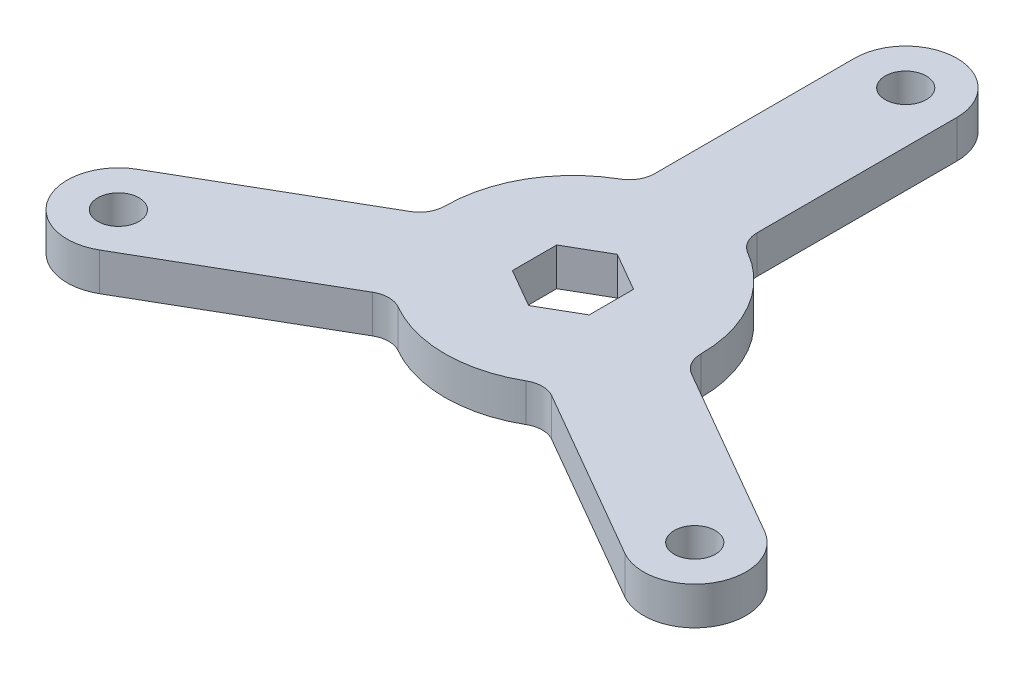
ISO-10303-21;
HEADER;
FILE_DESCRIPTION(('STEP AP214'),'2;1');
FILE_NAME('part.step','',(''),(''),'','','');
FILE_SCHEMA(('AUTOMOTIVE_DESIGN { 1 0 10303 214 1 1 1 1 }'));
ENDSEC;
DATA;
#1=APPLICATION_CONTEXT('core data for automotive mechanical design processes');
#2=APPLICATION_PROTOCOL_DEFINITION('international standard','automotive_design',2000,#1);
#3=PRODUCT_CONTEXT('',#1,'mechanical');
#4=PRODUCT('Part','Part','',(#3));
#5=PRODUCT_RELATED_PRODUCT_CATEGORY('part','',(#4));
#6=PRODUCT_DEFINITION_FORMATION('','',#4);
#7=PRODUCT_DEFINITION_CONTEXT('part definition',#1,'design');
#8=PRODUCT_DEFINITION('design','',#6,#7);
#9=PRODUCT_DEFINITION_SHAPE('','',#8);
#10=(LENGTH_UNIT() NAMED_UNIT(*) SI_UNIT(.MILLI.,.METRE.));
#11=(NAMED_UNIT(*) PLANE_ANGLE_UNIT() SI_UNIT($,.RADIAN.));
#12=(NAMED_UNIT(*) SI_UNIT($,.STERADIAN.) SOLID_ANGLE_UNIT());
#13=UNCERTAINTY_MEASURE_WITH_UNIT(LENGTH_MEASURE(1.E-05),#10,'distance_accuracy_value','');
#14=(GEOMETRIC_REPRESENTATION_CONTEXT(3) GLOBAL_UNCERTAINTY_ASSIGNED_CONTEXT((#13)) GLOBAL_UNIT_ASSIGNED_CONTEXT((#10,
#11,#12)) REPRESENTATION_CONTEXT('',''));
#15=CARTESIAN_POINT('',(0.,0.,0.));
#16=DIRECTION('',(0.,0.,1.));
#17=DIRECTION('',(1.,0.,0.));
#18=AXIS2_PLACEMENT_3D('',#15,#16,#17);
#19=CARTESIAN_POINT('',(0.,2.3495,0.));
#20=DIRECTION('',(0.,-1.,0.));
#21=DIRECTION('',(0.,0.,-1.));
#22=AXIS2_PLACEMENT_3D('',#19,#20,#21);
#23=CYLINDRICAL_SURFACE('',#22,15.875);
#24=CARTESIAN_POINT('',(0.,2.3495,0.));
#25=DIRECTION('',(0.,1.,0.));
#26=DIRECTION('',(0.,0.,1.));
#27=AXIS2_PLACEMENT_3D('',#24,#25,#26);
#28=CIRCLE('',#27,15.875);
#29=CARTESIAN_POINT('',(15.875,2.3495,-1.50342701251323E-13));
#30=VERTEX_POINT('',#29);
#31=CARTESIAN_POINT('',(7.9375,2.3495,-13.748153285078));
#32=VERTEX_POINT('',#31);
#33=EDGE_CURVE('E249',#30,#32,#28,.T.);
#34=ORIENTED_EDGE('',*,*,#33,.F.);
#35=DIRECTION('',(0.,-1.,0.));
#36=VECTOR('',#35,1.);
#37=CARTESIAN_POINT('',(15.875,2.3495,-1.50342701251323E-13));
#38=LINE('',#37,#36);
#39=CARTESIAN_POINT('',(15.875,-2.3495,-1.50342701251323E-13));
#40=VERTEX_POINT('',#39);
#41=EDGE_CURVE('E52',#30,#40,#38,.T.);
#42=ORIENTED_EDGE('',*,*,#41,.T.);
#43=CARTESIAN_POINT('',(0.,-2.3495,0.));
#44=DIRECTION('',(0.,1.,0.));
#45=DIRECTION('',(0.,0.,1.));
#46=AXIS2_PLACEMENT_3D('',#43,#44,#45);
#47=CIRCLE('',#46,15.875);
#48=CARTESIAN_POINT('',(7.9375,-2.3495,-13.748153285078));
#49=VERTEX_POINT('',#48);
#50=EDGE_CURVE('E410',#40,#49,#47,.T.);
#51=ORIENTED_EDGE('',*,*,#50,.T.);
#52=DIRECTION('',(0.,-1.,0.));
#53=VECTOR('',#52,1.);
#54=CARTESIAN_POINT('',(7.9375,2.3495,-13.748153285078));
#55=LINE('',#54,#53);
#56=EDGE_CURVE('E433',#49,#32,#55,.F.);
#57=ORIENTED_EDGE('',*,*,#56,.T.);
#58=EDGE_LOOP('',(#34,#42,#51,#57));
#59=FACE_BOUND('',#58,.T.);
#60=ADVANCED_FACE('F37',(#59),#23,.T.);
#61=CARTESIAN_POINT('',(-7.93749999999993,-2.3495,13.748153285078));
#62=VERTEX_POINT('',#61);
#63=CARTESIAN_POINT('',(7.93750000000013,-2.3495,13.7481532850779));
#64=VERTEX_POINT('',#63);
#65=EDGE_CURVE('E413',#62,#64,#47,.T.);
#66=ORIENTED_EDGE('',*,*,#65,.T.);
#67=DIRECTION('',(0.,-1.,0.));
#68=VECTOR('',#67,1.);
#69=CARTESIAN_POINT('',(7.93750000000013,2.3495,13.7481532850779));
#70=LINE('',#69,#68);
#71=CARTESIAN_POINT('',(7.93750000000013,2.3495,13.7481532850779));
#72=VERTEX_POINT('',#71);
#73=EDGE_CURVE('E454',#64,#72,#70,.F.);
#74=ORIENTED_EDGE('',*,*,#73,.T.);
#75=CARTESIAN_POINT('',(-7.93749999999993,2.3495,13.748153285078));
#76=VERTEX_POINT('',#75);
#77=EDGE_CURVE('E248',#76,#72,#28,.T.);
#78=ORIENTED_EDGE('',*,*,#77,.F.);
#79=DIRECTION('',(0.,-1.,0.));
#80=VECTOR('',#79,1.);
#81=CARTESIAN_POINT('',(-7.93749999999993,2.3495,13.748153285078));
#82=LINE('',#81,#80);
#83=EDGE_CURVE('E337',#76,#62,#82,.T.);
#84=ORIENTED_EDGE('',*,*,#83,.T.);
#85=EDGE_LOOP('',(#66,#74,#78,#84));
#86=FACE_BOUND('',#85,.T.);
#87=ADVANCED_FACE('F473',(#86),#23,.T.);
#88=CARTESIAN_POINT('',(0.,2.3495,0.));
#89=DIRECTION('',(0.,1.,0.));
#90=DIRECTION('',(0.,0.,1.));
#91=AXIS2_PLACEMENT_3D('',#88,#89,#90);
#92=PLANE('',#91);
#93=DIRECTION('',(0.,0.,1.));
#94=VECTOR('',#93,1.);
#95=CARTESIAN_POINT('',(-6.35,2.3495,-41.275));
#96=LINE('',#95,#94);
#97=CARTESIAN_POINT('',(-6.35,2.3495,-41.275));
#98=VERTEX_POINT('',#97);
#99=CARTESIAN_POINT('',(-6.35,2.3495,-16.4977839420936));
#100=VERTEX_POINT('',#99);
#101=EDGE_CURVE('E345',#98,#100,#96,.T.);
#102=ORIENTED_EDGE('',*,*,#101,.T.);
#103=CARTESIAN_POINT('',(-9.525,2.3495,-16.4977839420936));
#104=DIRECTION('',(0.,1.,0.));
#105=DIRECTION('',(0.,0.,1.));
#106=AXIS2_PLACEMENT_3D('',#103,#104,#105);
#107=CIRCLE('',#106,3.175);
#108=CARTESIAN_POINT('',(-7.9375,2.3495,-13.748153285078));
#109=VERTEX_POINT('',#108);
#110=EDGE_CURVE('E340',#100,#109,#107,.F.);
#111=ORIENTED_EDGE('',*,*,#110,.T.);
#112=CARTESIAN_POINT('',(-15.875,2.3495,0.));
#113=VERTEX_POINT('',#112);
#114=EDGE_CURVE('E241',#109,#113,#28,.T.);
#115=ORIENTED_EDGE('',*,*,#114,.T.);
#116=CARTESIAN_POINT('',(-19.05,2.3495,0.));
#117=DIRECTION('',(0.,1.,0.));
#118=DIRECTION('',(0.,0.,1.));
#119=AXIS2_PLACEMENT_3D('',#116,#117,#118);
#120=CIRCLE('',#119,3.175);
#121=CARTESIAN_POINT('',(-17.4625,2.3495,2.74963065701567));
#122=VERTEX_POINT('',#121);
#123=EDGE_CURVE('E336',#113,#122,#120,.F.);
#124=ORIENTED_EDGE('',*,*,#123,.T.);
#125=DIRECTION('',(-0.866025403784436,0.,0.500000000000004));
#126=VECTOR('',#125,1.);
#127=CARTESIAN_POINT('',(-15.7753906189451,2.3495,1.77557760171129));
#128=LINE('',#127,#126);
#129=CARTESIAN_POINT('',(-38.9201985412026,2.3495,15.138238685969));
#130=VERTEX_POINT('',#129);
#131=EDGE_CURVE('E268',#122,#130,#128,.T.);
#132=ORIENTED_EDGE('',*,*,#131,.T.);
#133=CARTESIAN_POINT('',(-35.7451985412026,2.3495,20.6375000000002));
#134=DIRECTION('',(0.,1.,0.));
#135=DIRECTION('',(0.866025403784436,0.,-0.500000000000004));
#136=AXIS2_PLACEMENT_3D('',#133,#134,#135);
#137=CIRCLE('',#136,6.35);
#138=CARTESIAN_POINT('',(-32.5701985412026,2.3495,26.1367613140313));
#139=VERTEX_POINT('',#138);
#140=EDGE_CURVE('E269',#130,#139,#137,.T.);
#141=ORIENTED_EDGE('',*,*,#140,.T.);
#142=DIRECTION('',(0.866025403784436,0.,-0.500000000000004));
#143=VECTOR('',#142,1.);
#144=CARTESIAN_POINT('',(-32.5701985412026,2.3495,26.1367613140313));
#145=LINE('',#144,#143);
#146=CARTESIAN_POINT('',(-11.1124999999999,2.3495,13.748153285078));
#147=VERTEX_POINT('',#146);
#148=EDGE_CURVE('E263',#139,#147,#145,.T.);
#149=ORIENTED_EDGE('',*,*,#148,.T.);
#150=CARTESIAN_POINT('',(-9.52499999999992,2.3495,16.4977839420936));
#151=DIRECTION('',(0.,1.,0.));
#152=DIRECTION('',(0.,0.,1.));
#153=AXIS2_PLACEMENT_3D('',#150,#151,#152);
#154=CIRCLE('',#153,3.175);
#155=EDGE_CURVE('E329',#147,#76,#154,.F.);
#156=ORIENTED_EDGE('',*,*,#155,.T.);
#157=ORIENTED_EDGE('',*,*,#77,.T.);
#158=CARTESIAN_POINT('',(9.52500000000015,2.3495,16.4977839420935));
#159=DIRECTION('',(0.,1.,0.));
#160=DIRECTION('',(0.,0.,1.));
#161=AXIS2_PLACEMENT_3D('',#158,#159,#160);
#162=CIRCLE('',#161,3.175);
#163=CARTESIAN_POINT('',(11.1125000000001,2.3495,13.7481532850779));
#164=VERTEX_POINT('',#163);
#165=EDGE_CURVE('E323',#72,#164,#162,.F.);
#166=ORIENTED_EDGE('',*,*,#165,.T.);
#167=DIRECTION('',(0.866025403784443,0.,0.499999999999992));
#168=VECTOR('',#167,1.);
#169=CARTESIAN_POINT('',(9.42539061894523,2.3495,12.7741002297735));
#170=LINE('',#169,#168);
#171=CARTESIAN_POINT('',(32.5701985412029,2.3495,26.1367613140309));
#172=VERTEX_POINT('',#171);
#173=EDGE_CURVE('E207',#164,#172,#170,.T.);
#174=ORIENTED_EDGE('',*,*,#173,.T.);
#175=CARTESIAN_POINT('',(35.7451985412029,2.3495,20.6374999999997));
#176=DIRECTION('',(0.,1.,0.));
#177=DIRECTION('',(-0.866025403784443,0.,-0.499999999999992));
#178=AXIS2_PLACEMENT_3D('',#175,#176,#177);
#179=CIRCLE('',#178,6.35);
#180=CARTESIAN_POINT('',(38.9201985412028,2.3495,15.1382386859685));
#181=VERTEX_POINT('',#180);
#182=EDGE_CURVE('E202',#172,#181,#179,.T.);
#183=ORIENTED_EDGE('',*,*,#182,.T.);
#184=DIRECTION('',(-0.866025403784443,0.,-0.499999999999992));
#185=VECTOR('',#184,1.);
#186=CARTESIAN_POINT('',(38.9201985412028,2.3495,15.1382386859685));
#187=LINE('',#186,#185);
#188=CARTESIAN_POINT('',(17.4625,2.3495,2.74963065701543));
#189=VERTEX_POINT('',#188);
#190=EDGE_CURVE('E210',#181,#189,#187,.T.);
#191=ORIENTED_EDGE('',*,*,#190,.T.);
#192=CARTESIAN_POINT('',(19.05,2.3495,-1.80411241501588E-13));
#193=DIRECTION('',(0.,1.,0.));
#194=DIRECTION('',(0.,0.,1.));
#195=AXIS2_PLACEMENT_3D('',#192,#193,#194);
#196=CIRCLE('',#195,3.175);
#197=EDGE_CURVE('E45',#189,#30,#196,.F.);
#198=ORIENTED_EDGE('',*,*,#197,.T.);
#199=ORIENTED_EDGE('',*,*,#33,.T.);
#200=CARTESIAN_POINT('',(9.525,2.3495,-16.4977839420936));
#201=DIRECTION('',(0.,1.,0.));
#202=DIRECTION('',(0.,0.,1.));
#203=AXIS2_PLACEMENT_3D('',#200,#201,#202);
#204=CIRCLE('',#203,3.175);
#205=CARTESIAN_POINT('',(6.35,2.3495,-16.4977839420936));
#206=VERTEX_POINT('',#205);
#207=EDGE_CURVE('E426',#32,#206,#204,.F.);
#208=ORIENTED_EDGE('',*,*,#207,.T.);
#209=DIRECTION('',(0.,0.,-1.));
#210=VECTOR('',#209,1.);
#211=CARTESIAN_POINT('',(6.35,2.3495,-14.5496778314848));
#212=LINE('',#211,#210);
#213=CARTESIAN_POINT('',(6.35,2.3495,-41.275));
#214=VERTEX_POINT('',#213);
#215=EDGE_CURVE('E346',#206,#214,#212,.T.);
#216=ORIENTED_EDGE('',*,*,#215,.T.);
#217=CARTESIAN_POINT('',(0.,2.3495,-41.275));
#218=DIRECTION('',(0.,1.,0.));
#219=DIRECTION('',(0.,0.,1.));
#220=AXIS2_PLACEMENT_3D('',#217,#218,#219);
#221=CIRCLE('',#220,6.35);
#222=EDGE_CURVE('E299',#214,#98,#221,.T.);
#223=ORIENTED_EDGE('',*,*,#222,.T.);
#224=EDGE_LOOP('',(#102,#111,#115,#124,#132,#141,#149,#156,#157,#166,#174,#183,#191,#198,#199,
#208,#216,#223));
#225=FACE_BOUND('',#224,.T.);
#226=DIRECTION('',(-0.866025403784439,0.,0.5));
#227=VECTOR('',#226,1.);
#228=CARTESIAN_POINT('',(0.,2.3495,-5.49926131403118));
#229=LINE('',#228,#227);
#230=CARTESIAN_POINT('',(0.,2.3495,-5.49926131403118));
#231=VERTEX_POINT('',#230);
#232=CARTESIAN_POINT('',(-4.7625,2.3495,-2.7496306570156));
#233=VERTEX_POINT('',#232);
#234=EDGE_CURVE('E365',#231,#233,#229,.T.);
#235=ORIENTED_EDGE('',*,*,#234,.F.);
#236=DIRECTION('',(-0.866025403784439,0.,-0.5));
#237=VECTOR('',#236,1.);
#238=CARTESIAN_POINT('',(4.76249999999999,2.3495,-2.7496306570156));
#239=LINE('',#238,#237);
#240=CARTESIAN_POINT('',(4.76249999999999,2.3495,-2.7496306570156));
#241=VERTEX_POINT('',#240);
#242=EDGE_CURVE('E361',#241,#231,#239,.T.);
#243=ORIENTED_EDGE('',*,*,#242,.F.);
#244=DIRECTION('',(0.,0.,-1.));
#245=VECTOR('',#244,1.);
#246=CARTESIAN_POINT('',(4.76249999999999,2.3495,2.74963065701559));
#247=LINE('',#246,#245);
#248=CARTESIAN_POINT('',(4.76249999999999,2.3495,2.74963065701559));
#249=VERTEX_POINT('',#248);
#250=EDGE_CURVE('E374',#249,#241,#247,.T.);
#251=ORIENTED_EDGE('',*,*,#250,.F.);
#252=DIRECTION('',(0.866025403784439,0.,-0.5));
#253=VECTOR('',#252,1.);
#254=CARTESIAN_POINT('',(0.,2.3495,5.49926131403118));
#255=LINE('',#254,#253);
#256=CARTESIAN_POINT('',(0.,2.3495,5.49926131403118));
#257=VERTEX_POINT('',#256);
#258=EDGE_CURVE('E379',#257,#249,#255,.T.);
#259=ORIENTED_EDGE('',*,*,#258,.F.);
#260=DIRECTION('',(0.866025403784439,0.,0.5));
#261=VECTOR('',#260,1.);
#262=CARTESIAN_POINT('',(-4.7625,2.3495,2.74963065701559));
#263=LINE('',#262,#261);
#264=CARTESIAN_POINT('',(-4.7625,2.3495,2.74963065701559));
#265=VERTEX_POINT('',#264);
#266=EDGE_CURVE('E810',#265,#257,#263,.T.);
#267=ORIENTED_EDGE('',*,*,#266,.F.);
#268=DIRECTION('',(0.,0.,1.));
#269=VECTOR('',#268,1.);
#270=CARTESIAN_POINT('',(-4.7625,2.3495,-2.7496306570156));
#271=LINE('',#270,#269);
#272=EDGE_CURVE('E814',#233,#265,#271,.T.);
#273=ORIENTED_EDGE('',*,*,#272,.F.);
#274=EDGE_LOOP('',(#235,#243,#251,#259,#267,#273));
#275=FACE_BOUND('',#274,.T.);
#276=CARTESIAN_POINT('',(0.,2.3495,-41.275));
#277=DIRECTION('',(0.,1.,0.));
#278=DIRECTION('',(0.,0.,1.));
#279=AXIS2_PLACEMENT_3D('',#276,#277,#278);
#280=CIRCLE('',#279,2.5527);
#281=CARTESIAN_POINT('',(0.,2.3495,-38.7223));
#282=VERTEX_POINT('',#281);
#283=EDGE_CURVE('E284',#282,#282,#280,.T.);
#284=ORIENTED_EDGE('',*,*,#283,.F.);
#285=EDGE_LOOP('',(#284));
#286=FACE_BOUND('',#285,.T.);
#287=CARTESIAN_POINT('',(-35.7451985412026,2.3495,20.6375000000002));
#288=DIRECTION('',(0.,1.,0.));
#289=DIRECTION('',(0.866025403784436,0.,-0.500000000000004));
#290=AXIS2_PLACEMENT_3D('',#287,#288,#289);
#291=CIRCLE('',#290,2.5527);
#292=CARTESIAN_POINT('',(-33.5344954929621,2.3495,19.3611500000002));
#293=VERTEX_POINT('',#292);
#294=EDGE_CURVE('E306',#293,#293,#291,.T.);
#295=ORIENTED_EDGE('',*,*,#294,.F.);
#296=EDGE_LOOP('',(#295));
#297=FACE_BOUND('',#296,.T.);
#298=CARTESIAN_POINT('',(35.7451985412029,2.3495,20.6374999999997));
#299=DIRECTION('',(0.,1.,0.));
#300=DIRECTION('',(-0.866025403784443,0.,-0.499999999999992));
#301=AXIS2_PLACEMENT_3D('',#298,#299,#300);
#302=CIRCLE('',#301,2.5527);
#303=CARTESIAN_POINT('',(33.5344954929623,2.3495,19.3611499999997));
#304=VERTEX_POINT('',#303);
#305=EDGE_CURVE('E222',#304,#304,#302,.T.);
#306=ORIENTED_EDGE('',*,*,#305,.F.);
#307=EDGE_LOOP('',(#306));
#308=FACE_BOUND('',#307,.T.);
#309=ADVANCED_FACE('F217',(#225,#275,#286,#297,#308),#92,.T.);
#310=CARTESIAN_POINT('',(0.,-2.3495,0.));
#311=DIRECTION('',(0.,1.,0.));
#312=DIRECTION('',(0.,0.,1.));
#313=AXIS2_PLACEMENT_3D('',#310,#311,#312);
#314=PLANE('',#313);
#315=CARTESIAN_POINT('',(-7.9375,-2.3495,-13.748153285078));
#316=VERTEX_POINT('',#315);
#317=CARTESIAN_POINT('',(-15.875,-2.3495,0.));
#318=VERTEX_POINT('',#317);
#319=EDGE_CURVE('E252',#316,#318,#47,.T.);
#320=ORIENTED_EDGE('',*,*,#319,.F.);
#321=CARTESIAN_POINT('',(-9.525,-2.3495,-16.4977839420936));
#322=DIRECTION('',(0.,1.,0.));
#323=DIRECTION('',(0.,0.,1.));
#324=AXIS2_PLACEMENT_3D('',#321,#322,#323);
#325=CIRCLE('',#324,3.175);
#326=CARTESIAN_POINT('',(-6.35,-2.3495,-16.4977839420936));
#327=VERTEX_POINT('',#326);
#328=EDGE_CURVE('E342',#316,#327,#325,.T.);
#329=ORIENTED_EDGE('',*,*,#328,.T.);
#330=DIRECTION('',(0.,0.,-1.));
#331=VECTOR('',#330,1.);
#332=CARTESIAN_POINT('',(-6.35,-2.3495,-41.275));
#333=LINE('',#332,#331);
#334=CARTESIAN_POINT('',(-6.35,-2.3495,-41.275));
#335=VERTEX_POINT('',#334);
#336=EDGE_CURVE('E286',#327,#335,#333,.T.);
#337=ORIENTED_EDGE('',*,*,#336,.T.);
#338=CARTESIAN_POINT('',(0.,-2.3495,-41.275));
#339=DIRECTION('',(0.,1.,0.));
#340=DIRECTION('',(0.,0.,1.));
#341=AXIS2_PLACEMENT_3D('',#338,#339,#340);
#342=CIRCLE('',#341,6.35);
#343=CARTESIAN_POINT('',(6.35,-2.3495,-41.275));
#344=VERTEX_POINT('',#343);
#345=EDGE_CURVE('E289',#335,#344,#342,.F.);
#346=ORIENTED_EDGE('',*,*,#345,.T.);
#347=DIRECTION('',(0.,0.,1.));
#348=VECTOR('',#347,1.);
#349=CARTESIAN_POINT('',(6.35,-2.3495,-14.5496778314848));
#350=LINE('',#349,#348);
#351=CARTESIAN_POINT('',(6.35,-2.3495,-16.4977839420936));
#352=VERTEX_POINT('',#351);
#353=EDGE_CURVE('E290',#344,#352,#350,.T.);
#354=ORIENTED_EDGE('',*,*,#353,.T.);
#355=CARTESIAN_POINT('',(9.525,-2.3495,-16.4977839420936));
#356=DIRECTION('',(0.,1.,0.));
#357=DIRECTION('',(0.,0.,1.));
#358=AXIS2_PLACEMENT_3D('',#355,#356,#357);
#359=CIRCLE('',#358,3.175);
#360=EDGE_CURVE('E343',#352,#49,#359,.T.);
#361=ORIENTED_EDGE('',*,*,#360,.T.);
#362=ORIENTED_EDGE('',*,*,#50,.F.);
#363=CARTESIAN_POINT('',(19.05,-2.3495,-1.80411241501588E-13));
#364=DIRECTION('',(0.,1.,0.));
#365=DIRECTION('',(0.,0.,1.));
#366=AXIS2_PLACEMENT_3D('',#363,#364,#365);
#367=CIRCLE('',#366,3.175);
#368=CARTESIAN_POINT('',(17.4625,-2.3495,2.74963065701543));
#369=VERTEX_POINT('',#368);
#370=EDGE_CURVE('E12',#40,#369,#367,.T.);
#371=ORIENTED_EDGE('',*,*,#370,.T.);
#372=DIRECTION('',(0.866025403784443,0.,0.499999999999992));
#373=VECTOR('',#372,1.);
#374=CARTESIAN_POINT('',(38.9201985412028,-2.3495,15.1382386859685));
#375=LINE('',#374,#373);
#376=CARTESIAN_POINT('',(38.9201985412028,-2.3495,15.1382386859685));
#377=VERTEX_POINT('',#376);
#378=EDGE_CURVE('E318',#369,#377,#375,.T.);
#379=ORIENTED_EDGE('',*,*,#378,.T.);
#380=CARTESIAN_POINT('',(35.7451985412029,-2.3495,20.6374999999997));
#381=DIRECTION('',(0.,1.,0.));
#382=DIRECTION('',(0.,0.,1.));
#383=AXIS2_PLACEMENT_3D('',#380,#381,#382);
#384=CIRCLE('',#383,6.35);
#385=CARTESIAN_POINT('',(32.5701985412029,-2.3495,26.1367613140309));
#386=VERTEX_POINT('',#385);
#387=EDGE_CURVE('E203',#377,#386,#384,.F.);
#388=ORIENTED_EDGE('',*,*,#387,.T.);
#389=DIRECTION('',(-0.866025403784443,0.,-0.499999999999992));
#390=VECTOR('',#389,1.);
#391=CARTESIAN_POINT('',(9.42539061894523,-2.3495,12.7741002297735));
#392=LINE('',#391,#390);
#393=CARTESIAN_POINT('',(11.1125000000001,-2.3495,13.7481532850779));
#394=VERTEX_POINT('',#393);
#395=EDGE_CURVE('E320',#386,#394,#392,.T.);
#396=ORIENTED_EDGE('',*,*,#395,.T.);
#397=CARTESIAN_POINT('',(9.52500000000015,-2.3495,16.4977839420935));
#398=DIRECTION('',(0.,1.,0.));
#399=DIRECTION('',(0.,0.,1.));
#400=AXIS2_PLACEMENT_3D('',#397,#398,#399);
#401=CIRCLE('',#400,3.175);
#402=EDGE_CURVE('E325',#394,#64,#401,.T.);
#403=ORIENTED_EDGE('',*,*,#402,.T.);
#404=ORIENTED_EDGE('',*,*,#65,.F.);
#405=CARTESIAN_POINT('',(-9.52499999999992,-2.3495,16.4977839420936));
#406=DIRECTION('',(0.,1.,0.));
#407=DIRECTION('',(0.,0.,1.));
#408=AXIS2_PLACEMENT_3D('',#405,#406,#407);
#409=CIRCLE('',#408,3.175);
#410=CARTESIAN_POINT('',(-11.1124999999999,-2.3495,13.748153285078));
#411=VERTEX_POINT('',#410);
#412=EDGE_CURVE('E330',#62,#411,#409,.T.);
#413=ORIENTED_EDGE('',*,*,#412,.T.);
#414=DIRECTION('',(-0.866025403784436,0.,0.500000000000004));
#415=VECTOR('',#414,1.);
#416=CARTESIAN_POINT('',(-32.5701985412026,-2.3495,26.1367613140313));
#417=LINE('',#416,#415);
#418=CARTESIAN_POINT('',(-32.5701985412026,-2.3495,26.1367613140313));
#419=VERTEX_POINT('',#418);
#420=EDGE_CURVE('E285',#411,#419,#417,.T.);
#421=ORIENTED_EDGE('',*,*,#420,.T.);
#422=CARTESIAN_POINT('',(-35.7451985412026,-2.3495,20.6375000000002));
#423=DIRECTION('',(0.,1.,0.));
#424=DIRECTION('',(0.,0.,1.));
#425=AXIS2_PLACEMENT_3D('',#422,#423,#424);
#426=CIRCLE('',#425,6.35);
#427=CARTESIAN_POINT('',(-38.9201985412026,-2.3495,15.138238685969));
#428=VERTEX_POINT('',#427);
#429=EDGE_CURVE('E312',#419,#428,#426,.F.);
#430=ORIENTED_EDGE('',*,*,#429,.T.);
#431=DIRECTION('',(0.866025403784436,0.,-0.500000000000004));
#432=VECTOR('',#431,1.);
#433=CARTESIAN_POINT('',(-15.7753906189451,-2.3495,1.77557760171129));
#434=LINE('',#433,#432);
#435=CARTESIAN_POINT('',(-17.4625,-2.3495,2.74963065701567));
#436=VERTEX_POINT('',#435);
#437=EDGE_CURVE('E279',#428,#436,#434,.T.);
#438=ORIENTED_EDGE('',*,*,#437,.T.);
#439=CARTESIAN_POINT('',(-19.05,-2.3495,0.));
#440=DIRECTION('',(0.,1.,0.));
#441=DIRECTION('',(0.,0.,1.));
#442=AXIS2_PLACEMENT_3D('',#439,#440,#441);
#443=CIRCLE('',#442,3.175);
#444=EDGE_CURVE('E331',#436,#318,#443,.T.);
#445=ORIENTED_EDGE('',*,*,#444,.T.);
#446=EDGE_LOOP('',(#320,#329,#337,#346,#354,#361,#362,#371,#379,#388,#396,#403,#404,#413,#421,
#430,#438,#445));
#447=FACE_BOUND('',#446,.T.);
#448=DIRECTION('',(-0.866025403784439,0.,-0.5));
#449=VECTOR('',#448,1.);
#450=CARTESIAN_POINT('',(4.76249999999999,-2.3495,-2.7496306570156));
#451=LINE('',#450,#449);
#452=CARTESIAN_POINT('',(4.76249999999999,-2.3495,-2.7496306570156));
#453=VERTEX_POINT('',#452);
#454=CARTESIAN_POINT('',(0.,-2.3495,-5.49926131403118));
#455=VERTEX_POINT('',#454);
#456=EDGE_CURVE('E360',#453,#455,#451,.T.);
#457=ORIENTED_EDGE('',*,*,#456,.T.);
#458=DIRECTION('',(-0.866025403784439,0.,0.5));
#459=VECTOR('',#458,1.);
#460=CARTESIAN_POINT('',(0.,-2.3495,-5.49926131403118));
#461=LINE('',#460,#459);
#462=CARTESIAN_POINT('',(-4.7625,-2.3495,-2.7496306570156));
#463=VERTEX_POINT('',#462);
#464=EDGE_CURVE('E384',#455,#463,#461,.T.);
#465=ORIENTED_EDGE('',*,*,#464,.T.);
#466=DIRECTION('',(0.,0.,1.));
#467=VECTOR('',#466,1.);
#468=CARTESIAN_POINT('',(-4.7625,-2.3495,-2.7496306570156));
#469=LINE('',#468,#467);
#470=CARTESIAN_POINT('',(-4.7625,-2.3495,2.74963065701559));
#471=VERTEX_POINT('',#470);
#472=EDGE_CURVE('E387',#463,#471,#469,.T.);
#473=ORIENTED_EDGE('',*,*,#472,.T.);
#474=DIRECTION('',(0.866025403784439,0.,0.5));
#475=VECTOR('',#474,1.);
#476=CARTESIAN_POINT('',(-4.7625,-2.3495,2.74963065701559));
#477=LINE('',#476,#475);
#478=CARTESIAN_POINT('',(0.,-2.3495,5.49926131403118));
#479=VERTEX_POINT('',#478);
#480=EDGE_CURVE('E390',#471,#479,#477,.T.);
#481=ORIENTED_EDGE('',*,*,#480,.T.);
#482=DIRECTION('',(0.866025403784439,0.,-0.5));
#483=VECTOR('',#482,1.);
#484=CARTESIAN_POINT('',(0.,-2.3495,5.49926131403118));
#485=LINE('',#484,#483);
#486=CARTESIAN_POINT('',(4.76249999999999,-2.3495,2.74963065701559));
#487=VERTEX_POINT('',#486);
#488=EDGE_CURVE('E393',#479,#487,#485,.T.);
#489=ORIENTED_EDGE('',*,*,#488,.T.);
#490=DIRECTION('',(0.,0.,-1.));
#491=VECTOR('',#490,1.);
#492=CARTESIAN_POINT('',(4.76249999999999,-2.3495,2.74963065701559));
#493=LINE('',#492,#491);
#494=EDGE_CURVE('E366',#487,#453,#493,.T.);
#495=ORIENTED_EDGE('',*,*,#494,.T.);
#496=EDGE_LOOP('',(#457,#465,#473,#481,#489,#495));
#497=FACE_BOUND('',#496,.T.);
#498=CARTESIAN_POINT('',(0.,-2.3495,-41.275));
#499=DIRECTION('',(0.,1.,0.));
#500=DIRECTION('',(0.,0.,1.));
#501=AXIS2_PLACEMENT_3D('',#498,#499,#500);
#502=CIRCLE('',#501,2.5527);
#503=CARTESIAN_POINT('',(0.,-2.3495,-38.7223));
#504=VERTEX_POINT('',#503);
#505=EDGE_CURVE('E288',#504,#504,#502,.F.);
#506=ORIENTED_EDGE('',*,*,#505,.F.);
#507=EDGE_LOOP('',(#506));
#508=FACE_BOUND('',#507,.T.);
#509=CARTESIAN_POINT('',(-35.7451985412026,-2.3495,20.6375000000002));
#510=DIRECTION('',(0.,1.,0.));
#511=DIRECTION('',(0.,0.,1.));
#512=AXIS2_PLACEMENT_3D('',#509,#510,#511);
#513=CIRCLE('',#512,2.5527);
#514=CARTESIAN_POINT('',(-35.7451985412026,-2.3495,23.1902000000002));
#515=VERTEX_POINT('',#514);
#516=EDGE_CURVE('E281',#515,#515,#513,.F.);
#517=ORIENTED_EDGE('',*,*,#516,.F.);
#518=EDGE_LOOP('',(#517));
#519=FACE_BOUND('',#518,.T.);
#520=CARTESIAN_POINT('',(35.7451985412029,-2.3495,20.6374999999997));
#521=DIRECTION('',(0.,1.,0.));
#522=DIRECTION('',(0.,0.,1.));
#523=AXIS2_PLACEMENT_3D('',#520,#521,#522);
#524=CIRCLE('',#523,2.5527);
#525=CARTESIAN_POINT('',(35.7451985412029,-2.3495,23.1901999999997));
#526=VERTEX_POINT('',#525);
#527=EDGE_CURVE('E311',#526,#526,#524,.F.);
#528=ORIENTED_EDGE('',*,*,#527,.F.);
#529=EDGE_LOOP('',(#528));
#530=FACE_BOUND('',#529,.T.);
#531=ADVANCED_FACE('F465',(#447,#497,#508,#519,#530),#314,.F.);
#532=ORIENTED_EDGE('',*,*,#319,.T.);
#533=DIRECTION('',(0.,-1.,0.));
#534=VECTOR('',#533,1.);
#535=CARTESIAN_POINT('',(-15.875,2.3495,0.));
#536=LINE('',#535,#534);
#537=EDGE_CURVE('E444',#318,#113,#536,.F.);
#538=ORIENTED_EDGE('',*,*,#537,.T.);
#539=ORIENTED_EDGE('',*,*,#114,.F.);
#540=DIRECTION('',(0.,-1.,0.));
#541=VECTOR('',#540,1.);
#542=CARTESIAN_POINT('',(-7.9375,2.3495,-13.748153285078));
#543=LINE('',#542,#541);
#544=EDGE_CURVE('E247',#109,#316,#543,.T.);
#545=ORIENTED_EDGE('',*,*,#544,.T.);
#546=EDGE_LOOP('',(#532,#538,#539,#545));
#547=FACE_BOUND('',#546,.T.);
#548=ADVANCED_FACE('F490',(#547),#23,.T.);
#549=CARTESIAN_POINT('',(4.76249999999999,2.3495,-2.7496306570156));
#550=DIRECTION('',(-0.5,0.,0.866025403784439));
#551=DIRECTION('',(0.866025403784439,0.,0.5));
#552=AXIS2_PLACEMENT_3D('',#549,#550,#551);
#553=PLANE('',#552);
#554=ORIENTED_EDGE('',*,*,#456,.F.);
#555=DIRECTION('',(0.,-1.,0.));
#556=VECTOR('',#555,1.);
#557=CARTESIAN_POINT('',(4.76249999999999,2.3495,-2.7496306570156));
#558=LINE('',#557,#556);
#559=EDGE_CURVE('E378',#241,#453,#558,.T.);
#560=ORIENTED_EDGE('',*,*,#559,.F.);
#561=ORIENTED_EDGE('',*,*,#242,.T.);
#562=DIRECTION('',(0.,-1.,0.));
#563=VECTOR('',#562,1.);
#564=CARTESIAN_POINT('',(0.,2.3495,-5.49926131403118));
#565=LINE('',#564,#563);
#566=EDGE_CURVE('E250',#231,#455,#565,.T.);
#567=ORIENTED_EDGE('',*,*,#566,.T.);
#568=EDGE_LOOP('',(#554,#560,#561,#567));
#569=FACE_BOUND('',#568,.T.);
#570=ADVANCED_FACE('F497',(#569),#553,.T.);
#571=CARTESIAN_POINT('',(0.,2.3495,-5.49926131403118));
#572=DIRECTION('',(0.5,0.,0.866025403784439));
#573=DIRECTION('',(0.866025403784439,0.,-0.5));
#574=AXIS2_PLACEMENT_3D('',#571,#572,#573);
#575=PLANE('',#574);
#576=ORIENTED_EDGE('',*,*,#464,.F.);
#577=ORIENTED_EDGE('',*,*,#566,.F.);
#578=ORIENTED_EDGE('',*,*,#234,.T.);
#579=DIRECTION('',(0.,-1.,0.));
#580=VECTOR('',#579,1.);
#581=CARTESIAN_POINT('',(-4.7625,2.3495,-2.7496306570156));
#582=LINE('',#581,#580);
#583=EDGE_CURVE('E405',#233,#463,#582,.T.);
#584=ORIENTED_EDGE('',*,*,#583,.T.);
#585=EDGE_LOOP('',(#576,#577,#578,#584));
#586=FACE_BOUND('',#585,.T.);
#587=ADVANCED_FACE('F502',(#586),#575,.T.);
#588=CARTESIAN_POINT('',(-4.7625,2.3495,-2.7496306570156));
#589=DIRECTION('',(1.,0.,0.));
#590=DIRECTION('',(0.,0.,-1.));
#591=AXIS2_PLACEMENT_3D('',#588,#589,#590);
#592=PLANE('',#591);
#593=ORIENTED_EDGE('',*,*,#472,.F.);
#594=ORIENTED_EDGE('',*,*,#583,.F.);
#595=ORIENTED_EDGE('',*,*,#272,.T.);
#596=DIRECTION('',(0.,-1.,0.));
#597=VECTOR('',#596,1.);
#598=CARTESIAN_POINT('',(-4.7625,2.3495,2.74963065701559));
#599=LINE('',#598,#597);
#600=EDGE_CURVE('E404',#265,#471,#599,.T.);
#601=ORIENTED_EDGE('',*,*,#600,.T.);
#602=EDGE_LOOP('',(#593,#594,#595,#601));
#603=FACE_BOUND('',#602,.T.);
#604=ADVANCED_FACE('F511',(#603),#592,.T.);
#605=CARTESIAN_POINT('',(-4.7625,2.3495,2.74963065701559));
#606=DIRECTION('',(0.5,0.,-0.866025403784438));
#607=DIRECTION('',(-0.866025403784439,0.,-0.5));
#608=AXIS2_PLACEMENT_3D('',#605,#606,#607);
#609=PLANE('',#608);
#610=ORIENTED_EDGE('',*,*,#480,.F.);
#611=ORIENTED_EDGE('',*,*,#600,.F.);
#612=ORIENTED_EDGE('',*,*,#266,.T.);
#613=DIRECTION('',(0.,-1.,0.));
#614=VECTOR('',#613,1.);
#615=CARTESIAN_POINT('',(0.,2.3495,5.49926131403118));
#616=LINE('',#615,#614);
#617=EDGE_CURVE('E402',#257,#479,#616,.T.);
#618=ORIENTED_EDGE('',*,*,#617,.T.);
#619=EDGE_LOOP('',(#610,#611,#612,#618));
#620=FACE_BOUND('',#619,.T.);
#621=ADVANCED_FACE('F514',(#620),#609,.T.);
#622=CARTESIAN_POINT('',(0.,2.3495,5.49926131403118));
#623=DIRECTION('',(-0.5,0.,-0.866025403784439));
#624=DIRECTION('',(-0.866025403784439,0.,0.5));
#625=AXIS2_PLACEMENT_3D('',#622,#623,#624);
#626=PLANE('',#625);
#627=ORIENTED_EDGE('',*,*,#488,.F.);
#628=ORIENTED_EDGE('',*,*,#617,.F.);
#629=ORIENTED_EDGE('',*,*,#258,.T.);
#630=DIRECTION('',(0.,-1.,0.));
#631=VECTOR('',#630,1.);
#632=CARTESIAN_POINT('',(4.76249999999999,2.3495,2.74963065701559));
#633=LINE('',#632,#631);
#634=EDGE_CURVE('E400',#249,#487,#633,.T.);
#635=ORIENTED_EDGE('',*,*,#634,.T.);
#636=EDGE_LOOP('',(#627,#628,#629,#635));
#637=FACE_BOUND('',#636,.T.);
#638=ADVANCED_FACE('F518',(#637),#626,.T.);
#639=CARTESIAN_POINT('',(4.76249999999999,2.3495,2.74963065701559));
#640=DIRECTION('',(-1.,0.,0.));
#641=DIRECTION('',(0.,0.,1.));
#642=AXIS2_PLACEMENT_3D('',#639,#640,#641);
#643=PLANE('',#642);
#644=ORIENTED_EDGE('',*,*,#494,.F.);
#645=ORIENTED_EDGE('',*,*,#634,.F.);
#646=ORIENTED_EDGE('',*,*,#250,.T.);
#647=ORIENTED_EDGE('',*,*,#559,.T.);
#648=EDGE_LOOP('',(#644,#645,#646,#647));
#649=FACE_BOUND('',#648,.T.);
#650=ADVANCED_FACE('F522',(#649),#643,.T.);
#651=CARTESIAN_POINT('',(-6.35,-37.7792464928988,-41.275));
#652=DIRECTION('',(-1.,0.,0.));
#653=DIRECTION('',(0.,0.,1.));
#654=AXIS2_PLACEMENT_3D('',#651,#652,#653);
#655=PLANE('',#654);
#656=ORIENTED_EDGE('',*,*,#336,.F.);
#657=DIRECTION('',(0.,-1.,0.));
#658=VECTOR('',#657,1.);
#659=CARTESIAN_POINT('',(-6.35,-37.7792464928988,-16.4977839420936));
#660=LINE('',#659,#658);
#661=EDGE_CURVE('E435',#327,#100,#660,.F.);
#662=ORIENTED_EDGE('',*,*,#661,.T.);
#663=ORIENTED_EDGE('',*,*,#101,.F.);
#664=DIRECTION('',(0.,1.,0.));
#665=VECTOR('',#664,1.);
#666=CARTESIAN_POINT('',(-6.35,-37.7792464928988,-41.275));
#667=LINE('',#666,#665);
#668=EDGE_CURVE('E350',#335,#98,#667,.T.);
#669=ORIENTED_EDGE('',*,*,#668,.F.);
#670=EDGE_LOOP('',(#656,#662,#663,#669));
#671=FACE_BOUND('',#670,.T.);
#672=ADVANCED_FACE('F526',(#671),#655,.T.);
#673=CARTESIAN_POINT('',(6.35,-37.7792464928988,-14.5496778314848));
#674=DIRECTION('',(1.,0.,0.));
#675=DIRECTION('',(0.,0.,-1.));
#676=AXIS2_PLACEMENT_3D('',#673,#674,#675);
#677=PLANE('',#676);
#678=ORIENTED_EDGE('',*,*,#215,.F.);
#679=DIRECTION('',(0.,-1.,0.));
#680=VECTOR('',#679,1.);
#681=CARTESIAN_POINT('',(6.35,-37.7792464928988,-16.4977839420936));
#682=LINE('',#681,#680);
#683=EDGE_CURVE('E434',#206,#352,#682,.T.);
#684=ORIENTED_EDGE('',*,*,#683,.T.);
#685=ORIENTED_EDGE('',*,*,#353,.F.);
#686=DIRECTION('',(0.,1.,0.));
#687=VECTOR('',#686,1.);
#688=CARTESIAN_POINT('',(6.35,-37.7792464928988,-41.275));
#689=LINE('',#688,#687);
#690=EDGE_CURVE('E293',#344,#214,#689,.T.);
#691=ORIENTED_EDGE('',*,*,#690,.T.);
#692=EDGE_LOOP('',(#678,#684,#685,#691));
#693=FACE_BOUND('',#692,.T.);
#694=ADVANCED_FACE('F532',(#693),#677,.T.);
#695=CARTESIAN_POINT('',(0.,-37.7792464928988,-41.275));
#696=DIRECTION('',(0.,1.,0.));
#697=DIRECTION('',(0.,0.,1.));
#698=AXIS2_PLACEMENT_3D('',#695,#696,#697);
#699=CYLINDRICAL_SURFACE('',#698,6.35);
#700=ORIENTED_EDGE('',*,*,#345,.F.);
#701=ORIENTED_EDGE('',*,*,#668,.T.);
#702=ORIENTED_EDGE('',*,*,#222,.F.);
#703=ORIENTED_EDGE('',*,*,#690,.F.);
#704=EDGE_LOOP('',(#700,#701,#702,#703));
#705=FACE_BOUND('',#704,.T.);
#706=ADVANCED_FACE('F528',(#705),#699,.T.);
#707=CARTESIAN_POINT('',(0.,-37.7792464928988,-41.275));
#708=DIRECTION('',(0.,1.,0.));
#709=DIRECTION('',(0.,0.,1.));
#710=AXIS2_PLACEMENT_3D('',#707,#708,#709);
#711=CYLINDRICAL_SURFACE('',#710,2.5527);
#712=ORIENTED_EDGE('',*,*,#505,.T.);
#713=EDGE_LOOP('',(#712));
#714=FACE_BOUND('',#713,.T.);
#715=ORIENTED_EDGE('',*,*,#283,.T.);
#716=EDGE_LOOP('',(#715));
#717=FACE_BOUND('',#716,.T.);
#718=ADVANCED_FACE('F531',(#714,#717),#711,.F.);
#719=CARTESIAN_POINT('',(9.525,2.3495,-16.4977839420936));
#720=DIRECTION('',(0.,-1.,0.));
#721=DIRECTION('',(0.,0.,-1.));
#722=AXIS2_PLACEMENT_3D('',#719,#720,#721);
#723=CYLINDRICAL_SURFACE('',#722,3.175);
#724=ORIENTED_EDGE('',*,*,#360,.F.);
#725=ORIENTED_EDGE('',*,*,#683,.F.);
#726=ORIENTED_EDGE('',*,*,#207,.F.);
#727=ORIENTED_EDGE('',*,*,#56,.F.);
#728=EDGE_LOOP('',(#724,#725,#726,#727));
#729=FACE_BOUND('',#728,.T.);
#730=ADVANCED_FACE('F432',(#729),#723,.F.);
#731=CARTESIAN_POINT('',(-9.525,2.3495,-16.4977839420936));
#732=DIRECTION('',(0.,-1.,0.));
#733=DIRECTION('',(0.,0.,-1.));
#734=AXIS2_PLACEMENT_3D('',#731,#732,#733);
#735=CYLINDRICAL_SURFACE('',#734,3.175);
#736=ORIENTED_EDGE('',*,*,#328,.F.);
#737=ORIENTED_EDGE('',*,*,#544,.F.);
#738=ORIENTED_EDGE('',*,*,#110,.F.);
#739=ORIENTED_EDGE('',*,*,#661,.F.);
#740=EDGE_LOOP('',(#736,#737,#738,#739));
#741=FACE_BOUND('',#740,.T.);
#742=ADVANCED_FACE('F552',(#741),#735,.F.);
#743=CARTESIAN_POINT('',(-32.5701985412026,-43.6164041811297,26.1367613140313));
#744=DIRECTION('',(0.500000000000004,0.,0.866025403784436));
#745=DIRECTION('',(0.866025403784436,0.,-0.500000000000004));
#746=AXIS2_PLACEMENT_3D('',#743,#744,#745);
#747=PLANE('',#746);
#748=ORIENTED_EDGE('',*,*,#420,.F.);
#749=DIRECTION('',(0.,-1.,0.));
#750=VECTOR('',#749,1.);
#751=CARTESIAN_POINT('',(-11.1124999999999,-43.6164041811297,13.748153285078));
#752=LINE('',#751,#750);
#753=EDGE_CURVE('E448',#411,#147,#752,.F.);
#754=ORIENTED_EDGE('',*,*,#753,.T.);
#755=ORIENTED_EDGE('',*,*,#148,.F.);
#756=DIRECTION('',(0.,1.,0.));
#757=VECTOR('',#756,1.);
#758=CARTESIAN_POINT('',(-32.5701985412026,-43.6164041811297,26.1367613140313));
#759=LINE('',#758,#757);
#760=EDGE_CURVE('E275',#419,#139,#759,.T.);
#761=ORIENTED_EDGE('',*,*,#760,.F.);
#762=EDGE_LOOP('',(#748,#754,#755,#761));
#763=FACE_BOUND('',#762,.T.);
#764=ADVANCED_FACE('F549',(#763),#747,.T.);
#765=CARTESIAN_POINT('',(-15.7753906189451,-43.6164041811297,1.77557760171129));
#766=DIRECTION('',(-0.500000000000004,0.,-0.866025403784436));
#767=DIRECTION('',(-0.866025403784436,0.,0.500000000000004));
#768=AXIS2_PLACEMENT_3D('',#765,#766,#767);
#769=PLANE('',#768);
#770=ORIENTED_EDGE('',*,*,#131,.F.);
#771=DIRECTION('',(0.,-1.,0.));
#772=VECTOR('',#771,1.);
#773=CARTESIAN_POINT('',(-17.4625,-43.6164041811297,2.74963065701567));
#774=LINE('',#773,#772);
#775=EDGE_CURVE('E446',#122,#436,#774,.T.);
#776=ORIENTED_EDGE('',*,*,#775,.T.);
#777=ORIENTED_EDGE('',*,*,#437,.F.);
#778=DIRECTION('',(0.,1.,0.));
#779=VECTOR('',#778,1.);
#780=CARTESIAN_POINT('',(-38.9201985412026,-43.6164041811297,15.138238685969));
#781=LINE('',#780,#779);
#782=EDGE_CURVE('E276',#428,#130,#781,.T.);
#783=ORIENTED_EDGE('',*,*,#782,.T.);
#784=EDGE_LOOP('',(#770,#776,#777,#783));
#785=FACE_BOUND('',#784,.T.);
#786=ADVANCED_FACE('F547',(#785),#769,.T.);
#787=CARTESIAN_POINT('',(-35.7451985412026,-43.6164041811297,20.6375000000002));
#788=DIRECTION('',(0.,1.,0.));
#789=DIRECTION('',(0.,0.,1.));
#790=AXIS2_PLACEMENT_3D('',#787,#788,#789);
#791=CYLINDRICAL_SURFACE('',#790,6.35);
#792=ORIENTED_EDGE('',*,*,#429,.F.);
#793=ORIENTED_EDGE('',*,*,#760,.T.);
#794=ORIENTED_EDGE('',*,*,#140,.F.);
#795=ORIENTED_EDGE('',*,*,#782,.F.);
#796=EDGE_LOOP('',(#792,#793,#794,#795));
#797=FACE_BOUND('',#796,.T.);
#798=ADVANCED_FACE('F543',(#797),#791,.T.);
#799=CARTESIAN_POINT('',(-35.7451985412026,-43.6164041811297,20.6375000000002));
#800=DIRECTION('',(0.,1.,0.));
#801=DIRECTION('',(0.,0.,1.));
#802=AXIS2_PLACEMENT_3D('',#799,#800,#801);
#803=CYLINDRICAL_SURFACE('',#802,2.5527);
#804=ORIENTED_EDGE('',*,*,#516,.T.);
#805=EDGE_LOOP('',(#804));
#806=FACE_BOUND('',#805,.T.);
#807=ORIENTED_EDGE('',*,*,#294,.T.);
#808=EDGE_LOOP('',(#807));
#809=FACE_BOUND('',#808,.T.);
#810=ADVANCED_FACE('F546',(#806,#809),#803,.F.);
#811=CARTESIAN_POINT('',(38.9201985412028,-43.6164041811297,15.1382386859685));
#812=DIRECTION('',(0.499999999999992,0.,-0.866025403784443));
#813=DIRECTION('',(-0.866025403784443,0.,-0.499999999999992));
#814=AXIS2_PLACEMENT_3D('',#811,#812,#813);
#815=PLANE('',#814);
#816=ORIENTED_EDGE('',*,*,#378,.F.);
#817=DIRECTION('',(0.,-1.,0.));
#818=VECTOR('',#817,1.);
#819=CARTESIAN_POINT('',(17.4625,-43.6164041811297,2.74963065701543));
#820=LINE('',#819,#818);
#821=EDGE_CURVE('E213',#369,#189,#820,.F.);
#822=ORIENTED_EDGE('',*,*,#821,.T.);
#823=ORIENTED_EDGE('',*,*,#190,.F.);
#824=DIRECTION('',(0.,1.,0.));
#825=VECTOR('',#824,1.);
#826=CARTESIAN_POINT('',(38.9201985412028,-43.6164041811297,15.1382386859685));
#827=LINE('',#826,#825);
#828=EDGE_CURVE('E197',#377,#181,#827,.T.);
#829=ORIENTED_EDGE('',*,*,#828,.F.);
#830=EDGE_LOOP('',(#816,#822,#823,#829));
#831=FACE_BOUND('',#830,.T.);
#832=ADVANCED_FACE('F211',(#831),#815,.T.);
#833=CARTESIAN_POINT('',(9.42539061894523,-43.6164041811297,12.7741002297735));
#834=DIRECTION('',(-0.499999999999992,0.,0.866025403784443));
#835=DIRECTION('',(0.866025403784443,0.,0.499999999999992));
#836=AXIS2_PLACEMENT_3D('',#833,#834,#835);
#837=PLANE('',#836);
#838=ORIENTED_EDGE('',*,*,#173,.F.);
#839=DIRECTION('',(0.,-1.,0.));
#840=VECTOR('',#839,1.);
#841=CARTESIAN_POINT('',(11.1125000000001,-43.6164041811297,13.7481532850779));
#842=LINE('',#841,#840);
#843=EDGE_CURVE('E457',#164,#394,#842,.T.);
#844=ORIENTED_EDGE('',*,*,#843,.T.);
#845=ORIENTED_EDGE('',*,*,#395,.F.);
#846=DIRECTION('',(0.,1.,0.));
#847=VECTOR('',#846,1.);
#848=CARTESIAN_POINT('',(32.5701985412029,-43.6164041811297,26.1367613140309));
#849=LINE('',#848,#847);
#850=EDGE_CURVE('E206',#386,#172,#849,.T.);
#851=ORIENTED_EDGE('',*,*,#850,.T.);
#852=EDGE_LOOP('',(#838,#844,#845,#851));
#853=FACE_BOUND('',#852,.T.);
#854=ADVANCED_FACE('F478',(#853),#837,.T.);
#855=CARTESIAN_POINT('',(35.7451985412029,-43.6164041811297,20.6374999999997));
#856=DIRECTION('',(0.,1.,0.));
#857=DIRECTION('',(0.,0.,1.));
#858=AXIS2_PLACEMENT_3D('',#855,#856,#857);
#859=CYLINDRICAL_SURFACE('',#858,6.35);
#860=ORIENTED_EDGE('',*,*,#387,.F.);
#861=ORIENTED_EDGE('',*,*,#828,.T.);
#862=ORIENTED_EDGE('',*,*,#182,.F.);
#863=ORIENTED_EDGE('',*,*,#850,.F.);
#864=EDGE_LOOP('',(#860,#861,#862,#863));
#865=FACE_BOUND('',#864,.T.);
#866=ADVANCED_FACE('F199',(#865),#859,.T.);
#867=CARTESIAN_POINT('',(35.7451985412029,-43.6164041811297,20.6374999999997));
#868=DIRECTION('',(0.,1.,0.));
#869=DIRECTION('',(0.,0.,1.));
#870=AXIS2_PLACEMENT_3D('',#867,#868,#869);
#871=CYLINDRICAL_SURFACE('',#870,2.5527);
#872=ORIENTED_EDGE('',*,*,#527,.T.);
#873=EDGE_LOOP('',(#872));
#874=FACE_BOUND('',#873,.T.);
#875=ORIENTED_EDGE('',*,*,#305,.T.);
#876=EDGE_LOOP('',(#875));
#877=FACE_BOUND('',#876,.T.);
#878=ADVANCED_FACE('F562',(#874,#877),#871,.F.);
#879=CARTESIAN_POINT('',(-19.05,2.3495,0.));
#880=DIRECTION('',(0.,-1.,0.));
#881=DIRECTION('',(0.,0.,-1.));
#882=AXIS2_PLACEMENT_3D('',#879,#880,#881);
#883=CYLINDRICAL_SURFACE('',#882,3.175);
#884=ORIENTED_EDGE('',*,*,#444,.F.);
#885=ORIENTED_EDGE('',*,*,#775,.F.);
#886=ORIENTED_EDGE('',*,*,#123,.F.);
#887=ORIENTED_EDGE('',*,*,#537,.F.);
#888=EDGE_LOOP('',(#884,#885,#886,#887));
#889=FACE_BOUND('',#888,.T.);
#890=ADVANCED_FACE('F568',(#889),#883,.F.);
#891=CARTESIAN_POINT('',(-9.52499999999992,2.3495,16.4977839420936));
#892=DIRECTION('',(0.,-1.,0.));
#893=DIRECTION('',(0.,0.,-1.));
#894=AXIS2_PLACEMENT_3D('',#891,#892,#893);
#895=CYLINDRICAL_SURFACE('',#894,3.175);
#896=ORIENTED_EDGE('',*,*,#412,.F.);
#897=ORIENTED_EDGE('',*,*,#83,.F.);
#898=ORIENTED_EDGE('',*,*,#155,.F.);
#899=ORIENTED_EDGE('',*,*,#753,.F.);
#900=EDGE_LOOP('',(#896,#897,#898,#899));
#901=FACE_BOUND('',#900,.T.);
#902=ADVANCED_FACE('F487',(#901),#895,.F.);
#903=CARTESIAN_POINT('',(9.52500000000015,2.3495,16.4977839420935));
#904=DIRECTION('',(0.,-1.,0.));
#905=DIRECTION('',(0.,0.,-1.));
#906=AXIS2_PLACEMENT_3D('',#903,#904,#905);
#907=CYLINDRICAL_SURFACE('',#906,3.175);
#908=ORIENTED_EDGE('',*,*,#402,.F.);
#909=ORIENTED_EDGE('',*,*,#843,.F.);
#910=ORIENTED_EDGE('',*,*,#165,.F.);
#911=ORIENTED_EDGE('',*,*,#73,.F.);
#912=EDGE_LOOP('',(#908,#909,#910,#911));
#913=FACE_BOUND('',#912,.T.);
#914=ADVANCED_FACE('F476',(#913),#907,.F.);
#915=CARTESIAN_POINT('',(19.05,2.3495,-1.80411241501588E-13));
#916=DIRECTION('',(0.,-1.,0.));
#917=DIRECTION('',(0.,0.,-1.));
#918=AXIS2_PLACEMENT_3D('',#915,#916,#917);
#919=CYLINDRICAL_SURFACE('',#918,3.175);
#920=ORIENTED_EDGE('',*,*,#370,.F.);
#921=ORIENTED_EDGE('',*,*,#41,.F.);
#922=ORIENTED_EDGE('',*,*,#197,.F.);
#923=ORIENTED_EDGE('',*,*,#821,.F.);
#924=EDGE_LOOP('',(#920,#921,#922,#923));
#925=FACE_BOUND('',#924,.T.);
#926=ADVANCED_FACE('F39',(#925),#919,.F.);
#927=CLOSED_SHELL('',(#60,#87,#309,#531,#548,#570,#587,#604,#621,#638,#650,#672,#694,#706,#718,
#730,#742,#764,#786,#798,#810,#832,#854,#866,#878,#890,#902,#914,#926));
#928=MANIFOLD_SOLID_BREP('B2',#927);
#929=ADVANCED_BREP_SHAPE_REPRESENTATION('',(#18,#928),#14);
#930=SHAPE_DEFINITION_REPRESENTATION(#9,#929);
ENDSEC;
END-ISO-10303-21;
